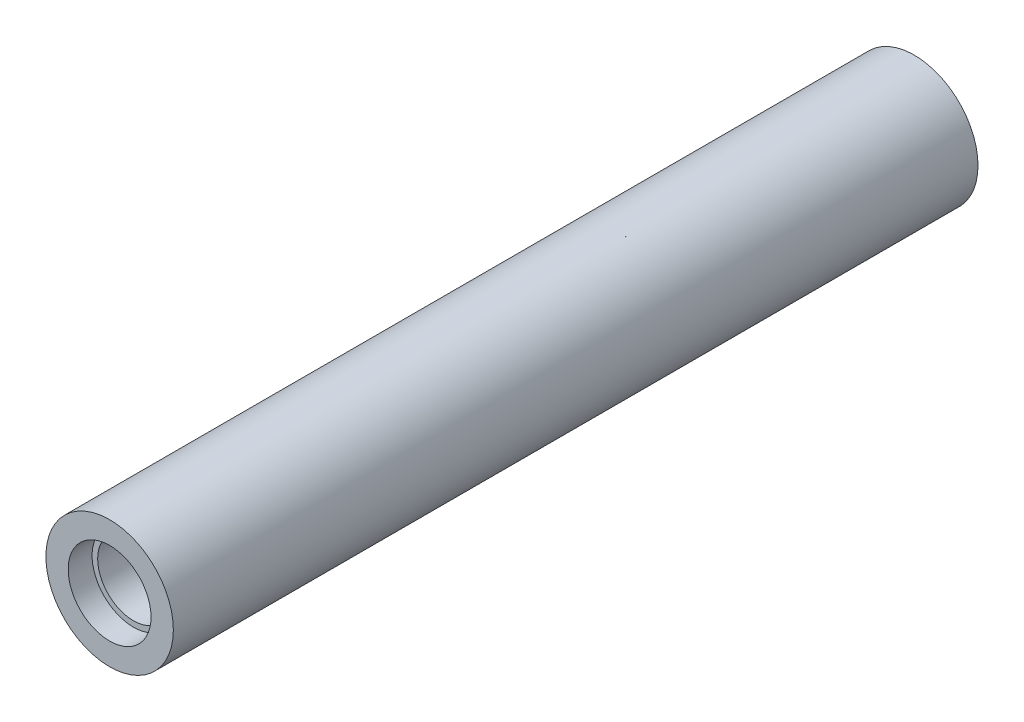
ISO-10303-21;
HEADER;
FILE_DESCRIPTION(('STEP AP214'),'2;1');
FILE_NAME('part.step','',(''),(''),'','','');
FILE_SCHEMA(('AUTOMOTIVE_DESIGN { 1 0 10303 214 1 1 1 1 }'));
ENDSEC;
DATA;
#1=APPLICATION_CONTEXT('core data for automotive mechanical design processes');
#2=APPLICATION_PROTOCOL_DEFINITION('international standard','automotive_design',2000,#1);
#3=PRODUCT_CONTEXT('',#1,'mechanical');
#4=PRODUCT('Part','Part','',(#3));
#5=PRODUCT_RELATED_PRODUCT_CATEGORY('part','',(#4));
#6=PRODUCT_DEFINITION_FORMATION('','',#4);
#7=PRODUCT_DEFINITION_CONTEXT('part definition',#1,'design');
#8=PRODUCT_DEFINITION('design','',#6,#7);
#9=PRODUCT_DEFINITION_SHAPE('','',#8);
#10=(LENGTH_UNIT() NAMED_UNIT(*) SI_UNIT(.MILLI.,.METRE.));
#11=(NAMED_UNIT(*) PLANE_ANGLE_UNIT() SI_UNIT($,.RADIAN.));
#12=(NAMED_UNIT(*) SI_UNIT($,.STERADIAN.) SOLID_ANGLE_UNIT());
#13=UNCERTAINTY_MEASURE_WITH_UNIT(LENGTH_MEASURE(1.E-05),#10,'distance_accuracy_value','');
#14=(GEOMETRIC_REPRESENTATION_CONTEXT(3) GLOBAL_UNCERTAINTY_ASSIGNED_CONTEXT((#13)) GLOBAL_UNIT_ASSIGNED_CONTEXT((#10,
#11,#12)) REPRESENTATION_CONTEXT('',''));
#15=CARTESIAN_POINT('',(0.,0.,0.));
#16=DIRECTION('',(0.,0.,1.));
#17=DIRECTION('',(1.,0.,0.));
#18=AXIS2_PLACEMENT_3D('',#15,#16,#17);
#19=CARTESIAN_POINT('',(0.,0.,252.5));
#20=DIRECTION('',(0.,0.,-1.));
#21=DIRECTION('',(-1.,0.,0.));
#22=AXIS2_PLACEMENT_3D('',#19,#20,#21);
#23=CYLINDRICAL_SURFACE('',#22,22.5);
#24=CARTESIAN_POINT('',(0.,0.,237.5));
#25=DIRECTION('',(0.,0.,1.));
#26=DIRECTION('',(1.,0.,0.));
#27=AXIS2_PLACEMENT_3D('',#24,#25,#26);
#28=CIRCLE('',#27,22.5);
#29=CARTESIAN_POINT('',(22.5,0.,237.5));
#30=VERTEX_POINT('',#29);
#31=EDGE_CURVE('E46',#30,#30,#28,.T.);
#32=ORIENTED_EDGE('',*,*,#31,.T.);
#33=EDGE_LOOP('',(#32));
#34=FACE_BOUND('',#33,.T.);
#35=CARTESIAN_POINT('',(0.,0.,-237.5));
#36=DIRECTION('',(0.,0.,-1.));
#37=DIRECTION('',(-1.,0.,0.));
#38=AXIS2_PLACEMENT_3D('',#35,#36,#37);
#39=CIRCLE('',#38,22.5);
#40=CARTESIAN_POINT('',(-22.5,0.,-237.5));
#41=VERTEX_POINT('',#40);
#42=EDGE_CURVE('E55',#41,#41,#39,.T.);
#43=ORIENTED_EDGE('',*,*,#42,.T.);
#44=EDGE_LOOP('',(#43));
#45=FACE_BOUND('',#44,.T.);
#46=ADVANCED_FACE('F30',(#34,#45),#23,.F.);
#47=CARTESIAN_POINT('',(0.,0.,252.5));
#48=DIRECTION('',(0.,0.,1.));
#49=DIRECTION('',(1.,0.,0.));
#50=AXIS2_PLACEMENT_3D('',#47,#48,#49);
#51=PLANE('',#50);
#52=CARTESIAN_POINT('',(0.,0.,252.5));
#53=DIRECTION('',(0.,0.,1.));
#54=DIRECTION('',(1.,0.,0.));
#55=AXIS2_PLACEMENT_3D('',#52,#53,#54);
#56=CIRCLE('',#55,26.);
#57=CARTESIAN_POINT('',(26.,0.,252.5));
#58=VERTEX_POINT('',#57);
#59=EDGE_CURVE('E43',#58,#58,#56,.T.);
#60=ORIENTED_EDGE('',*,*,#59,.F.);
#61=EDGE_LOOP('',(#60));
#62=FACE_BOUND('',#61,.T.);
#63=CARTESIAN_POINT('',(0.,0.,252.5));
#64=DIRECTION('',(0.,0.,1.));
#65=DIRECTION('',(1.,0.,0.));
#66=AXIS2_PLACEMENT_3D('',#63,#64,#65);
#67=CIRCLE('',#66,40.);
#68=CARTESIAN_POINT('',(40.,0.,252.5));
#69=VERTEX_POINT('',#68);
#70=EDGE_CURVE('E10',#69,#69,#67,.T.);
#71=ORIENTED_EDGE('',*,*,#70,.T.);
#72=EDGE_LOOP('',(#71));
#73=FACE_BOUND('',#72,.T.);
#74=ADVANCED_FACE('F78',(#62,#73),#51,.T.);
#75=CARTESIAN_POINT('',(0.,0.,-252.5));
#76=DIRECTION('',(0.,0.,1.));
#77=DIRECTION('',(1.,0.,0.));
#78=AXIS2_PLACEMENT_3D('',#75,#76,#77);
#79=PLANE('',#78);
#80=CARTESIAN_POINT('',(0.,0.,-252.5));
#81=DIRECTION('',(0.,0.,-1.));
#82=DIRECTION('',(-1.,0.,0.));
#83=AXIS2_PLACEMENT_3D('',#80,#81,#82);
#84=CIRCLE('',#83,26.);
#85=CARTESIAN_POINT('',(-26.,0.,-252.5));
#86=VERTEX_POINT('',#85);
#87=EDGE_CURVE('E52',#86,#86,#84,.T.);
#88=ORIENTED_EDGE('',*,*,#87,.F.);
#89=EDGE_LOOP('',(#88));
#90=FACE_BOUND('',#89,.T.);
#91=CARTESIAN_POINT('',(0.,0.,-252.5));
#92=DIRECTION('',(0.,0.,1.));
#93=DIRECTION('',(1.,0.,0.));
#94=AXIS2_PLACEMENT_3D('',#91,#92,#93);
#95=CIRCLE('',#94,40.);
#96=CARTESIAN_POINT('',(40.,0.,-252.5));
#97=VERTEX_POINT('',#96);
#98=EDGE_CURVE('E34',#97,#97,#95,.T.);
#99=ORIENTED_EDGE('',*,*,#98,.F.);
#100=EDGE_LOOP('',(#99));
#101=FACE_BOUND('',#100,.T.);
#102=ADVANCED_FACE('F75',(#90,#101),#79,.F.);
#103=CARTESIAN_POINT('',(0.,0.,252.5));
#104=DIRECTION('',(0.,0.,-1.));
#105=DIRECTION('',(-1.,0.,0.));
#106=AXIS2_PLACEMENT_3D('',#103,#104,#105);
#107=CYLINDRICAL_SURFACE('',#106,40.);
#108=ORIENTED_EDGE('',*,*,#70,.F.);
#109=EDGE_LOOP('',(#108));
#110=FACE_BOUND('',#109,.T.);
#111=ORIENTED_EDGE('',*,*,#98,.T.);
#112=EDGE_LOOP('',(#111));
#113=FACE_BOUND('',#112,.T.);
#114=ADVANCED_FACE('F32',(#110,#113),#107,.T.);
#115=CARTESIAN_POINT('',(0.,0.,237.5));
#116=DIRECTION('',(0.,0.,1.));
#117=DIRECTION('',(1.,0.,0.));
#118=AXIS2_PLACEMENT_3D('',#115,#116,#117);
#119=CYLINDRICAL_SURFACE('',#118,26.);
#120=CARTESIAN_POINT('',(0.,0.,237.5));
#121=DIRECTION('',(0.,0.,1.));
#122=DIRECTION('',(1.,0.,0.));
#123=AXIS2_PLACEMENT_3D('',#120,#121,#122);
#124=CIRCLE('',#123,26.);
#125=CARTESIAN_POINT('',(26.,0.,237.5));
#126=VERTEX_POINT('',#125);
#127=EDGE_CURVE('E41',#126,#126,#124,.T.);
#128=ORIENTED_EDGE('',*,*,#127,.F.);
#129=EDGE_LOOP('',(#128));
#130=FACE_BOUND('',#129,.T.);
#131=ORIENTED_EDGE('',*,*,#59,.T.);
#132=EDGE_LOOP('',(#131));
#133=FACE_BOUND('',#132,.T.);
#134=ADVANCED_FACE('F82',(#130,#133),#119,.F.);
#135=CARTESIAN_POINT('',(0.,0.,237.5));
#136=DIRECTION('',(0.,0.,1.));
#137=DIRECTION('',(1.,0.,0.));
#138=AXIS2_PLACEMENT_3D('',#135,#136,#137);
#139=PLANE('',#138);
#140=ORIENTED_EDGE('',*,*,#31,.F.);
#141=EDGE_LOOP('',(#140));
#142=FACE_BOUND('',#141,.T.);
#143=ORIENTED_EDGE('',*,*,#127,.T.);
#144=EDGE_LOOP('',(#143));
#145=FACE_BOUND('',#144,.T.);
#146=ADVANCED_FACE('F71',(#142,#145),#139,.T.);
#147=CARTESIAN_POINT('',(0.,0.,-237.5));
#148=DIRECTION('',(0.,0.,-1.));
#149=DIRECTION('',(-1.,0.,0.));
#150=AXIS2_PLACEMENT_3D('',#147,#148,#149);
#151=CYLINDRICAL_SURFACE('',#150,26.);
#152=CARTESIAN_POINT('',(0.,0.,-237.5));
#153=DIRECTION('',(0.,0.,-1.));
#154=DIRECTION('',(-1.,0.,0.));
#155=AXIS2_PLACEMENT_3D('',#152,#153,#154);
#156=CIRCLE('',#155,26.);
#157=CARTESIAN_POINT('',(-26.,0.,-237.5));
#158=VERTEX_POINT('',#157);
#159=EDGE_CURVE('E51',#158,#158,#156,.T.);
#160=ORIENTED_EDGE('',*,*,#159,.F.);
#161=EDGE_LOOP('',(#160));
#162=FACE_BOUND('',#161,.T.);
#163=ORIENTED_EDGE('',*,*,#87,.T.);
#164=EDGE_LOOP('',(#163));
#165=FACE_BOUND('',#164,.T.);
#166=ADVANCED_FACE('F65',(#162,#165),#151,.F.);
#167=CARTESIAN_POINT('',(0.,0.,-237.5));
#168=DIRECTION('',(0.,0.,-1.));
#169=DIRECTION('',(-1.,0.,0.));
#170=AXIS2_PLACEMENT_3D('',#167,#168,#169);
#171=PLANE('',#170);
#172=ORIENTED_EDGE('',*,*,#42,.F.);
#173=EDGE_LOOP('',(#172));
#174=FACE_BOUND('',#173,.T.);
#175=ORIENTED_EDGE('',*,*,#159,.T.);
#176=EDGE_LOOP('',(#175));
#177=FACE_BOUND('',#176,.T.);
#178=ADVANCED_FACE('F62',(#174,#177),#171,.T.);
#179=CLOSED_SHELL('',(#46,#74,#102,#114,#134,#146,#166,#178));
#180=MANIFOLD_SOLID_BREP('B2',#179);
#181=ADVANCED_BREP_SHAPE_REPRESENTATION('',(#18,#180),#14);
#182=SHAPE_DEFINITION_REPRESENTATION(#9,#181);
ENDSEC;
END-ISO-10303-21;
